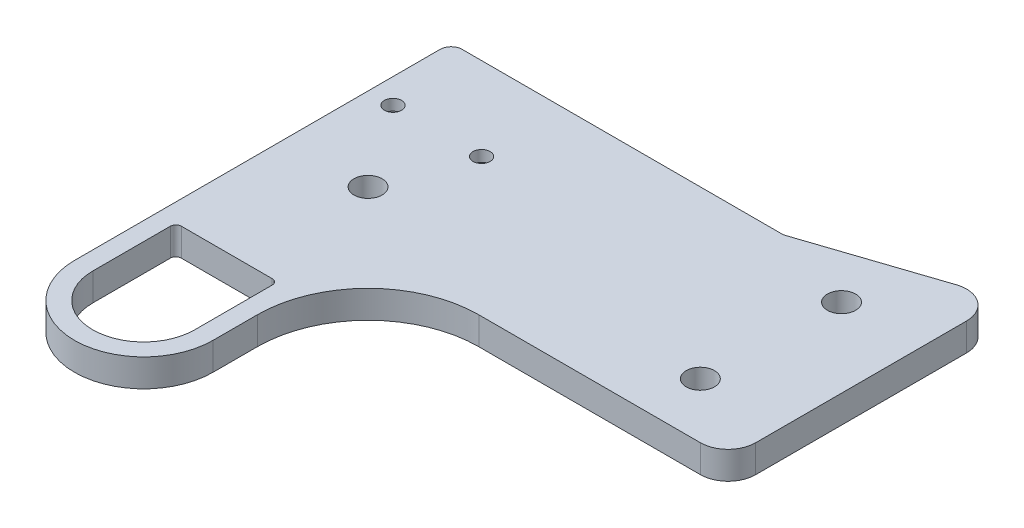
ISO-10303-21;
HEADER;
FILE_DESCRIPTION(('STEP AP214'),'2;1');
FILE_NAME('part.step','',(''),(''),'','','');
FILE_SCHEMA(('AUTOMOTIVE_DESIGN { 1 0 10303 214 1 1 1 1 }'));
ENDSEC;
DATA;
#1=APPLICATION_CONTEXT('core data for automotive mechanical design processes');
#2=APPLICATION_PROTOCOL_DEFINITION('international standard','automotive_design',2000,#1);
#3=PRODUCT_CONTEXT('',#1,'mechanical');
#4=PRODUCT('Part','Part','',(#3));
#5=PRODUCT_RELATED_PRODUCT_CATEGORY('part','',(#4));
#6=PRODUCT_DEFINITION_FORMATION('','',#4);
#7=PRODUCT_DEFINITION_CONTEXT('part definition',#1,'design');
#8=PRODUCT_DEFINITION('design','',#6,#7);
#9=PRODUCT_DEFINITION_SHAPE('','',#8);
#10=(LENGTH_UNIT() NAMED_UNIT(*) SI_UNIT(.MILLI.,.METRE.));
#11=(NAMED_UNIT(*) PLANE_ANGLE_UNIT() SI_UNIT($,.RADIAN.));
#12=(NAMED_UNIT(*) SI_UNIT($,.STERADIAN.) SOLID_ANGLE_UNIT());
#13=UNCERTAINTY_MEASURE_WITH_UNIT(LENGTH_MEASURE(1.E-05),#10,'distance_accuracy_value','');
#14=(GEOMETRIC_REPRESENTATION_CONTEXT(3) GLOBAL_UNCERTAINTY_ASSIGNED_CONTEXT((#13)) GLOBAL_UNIT_ASSIGNED_CONTEXT((#10,
#11,#12)) REPRESENTATION_CONTEXT('',''));
#15=CARTESIAN_POINT('',(0.,0.,0.));
#16=DIRECTION('',(0.,0.,1.));
#17=DIRECTION('',(1.,0.,0.));
#18=AXIS2_PLACEMENT_3D('',#15,#16,#17);
#19=CARTESIAN_POINT('',(4.50000000000001,0.,-4.99999999999998));
#20=DIRECTION('',(0.,1.,0.));
#21=DIRECTION('',(0.,0.,1.));
#22=AXIS2_PLACEMENT_3D('',#19,#20,#21);
#23=CYLINDRICAL_SURFACE('',#22,1.55);
#24=CARTESIAN_POINT('',(4.50000000000001,5.,-4.99999999999998));
#25=DIRECTION('',(0.,1.,0.));
#26=DIRECTION('',(0.,0.,-1.));
#27=AXIS2_PLACEMENT_3D('',#24,#25,#26);
#28=CIRCLE('',#27,1.55);
#29=CARTESIAN_POINT('',(4.50000000000001,5.,-6.54999999999998));
#30=VERTEX_POINT('',#29);
#31=EDGE_CURVE('E388',#30,#30,#28,.T.);
#32=ORIENTED_EDGE('',*,*,#31,.T.);
#33=EDGE_LOOP('',(#32));
#34=FACE_BOUND('',#33,.T.);
#35=CARTESIAN_POINT('',(4.50000000000001,3.,-4.99999999999998));
#36=DIRECTION('',(0.,-1.,0.));
#37=DIRECTION('',(0.,0.,-1.));
#38=AXIS2_PLACEMENT_3D('',#35,#36,#37);
#39=CIRCLE('',#38,1.55);
#40=CARTESIAN_POINT('',(4.50000000000001,3.,-6.54999999999998));
#41=VERTEX_POINT('',#40);
#42=EDGE_CURVE('E42',#41,#41,#39,.F.);
#43=ORIENTED_EDGE('',*,*,#42,.F.);
#44=EDGE_LOOP('',(#43));
#45=FACE_BOUND('',#44,.T.);
#46=ADVANCED_FACE('F38',(#34,#45),#23,.F.);
#47=CARTESIAN_POINT('',(20.5,0.,-4.99999999999998));
#48=DIRECTION('',(0.,1.,0.));
#49=DIRECTION('',(0.,0.,1.));
#50=AXIS2_PLACEMENT_3D('',#47,#48,#49);
#51=CYLINDRICAL_SURFACE('',#50,1.55);
#52=CARTESIAN_POINT('',(20.5,5.,-4.99999999999998));
#53=DIRECTION('',(0.,1.,0.));
#54=DIRECTION('',(0.,0.,1.));
#55=AXIS2_PLACEMENT_3D('',#52,#53,#54);
#56=CIRCLE('',#55,1.55);
#57=CARTESIAN_POINT('',(20.5,5.,-3.44999999999999));
#58=VERTEX_POINT('',#57);
#59=EDGE_CURVE('E406',#58,#58,#56,.T.);
#60=ORIENTED_EDGE('',*,*,#59,.T.);
#61=EDGE_LOOP('',(#60));
#62=FACE_BOUND('',#61,.T.);
#63=CARTESIAN_POINT('',(20.5,3.,-4.99999999999998));
#64=DIRECTION('',(0.,-1.,0.));
#65=DIRECTION('',(0.,0.,-1.));
#66=AXIS2_PLACEMENT_3D('',#63,#64,#65);
#67=CIRCLE('',#66,1.55);
#68=CARTESIAN_POINT('',(20.5,3.,-6.54999999999998));
#69=VERTEX_POINT('',#68);
#70=EDGE_CURVE('E379',#69,#69,#67,.F.);
#71=ORIENTED_EDGE('',*,*,#70,.F.);
#72=EDGE_LOOP('',(#71));
#73=FACE_BOUND('',#72,.T.);
#74=ADVANCED_FACE('F479',(#62,#73),#51,.F.);
#75=CARTESIAN_POINT('',(12.5,5.,48.));
#76=DIRECTION('',(0.,1.,0.));
#77=DIRECTION('',(0.,0.,1.));
#78=AXIS2_PLACEMENT_3D('',#75,#76,#77);
#79=PLANE('',#78);
#80=ORIENTED_EDGE('',*,*,#59,.F.);
#81=EDGE_LOOP('',(#80));
#82=FACE_BOUND('',#81,.T.);
#83=ORIENTED_EDGE('',*,*,#31,.F.);
#84=EDGE_LOOP('',(#83));
#85=FACE_BOUND('',#84,.T.);
#86=CARTESIAN_POINT('',(4.30000000000001,5.,34.));
#87=DIRECTION('',(0.,1.,0.));
#88=DIRECTION('',(0.,0.,-1.));
#89=AXIS2_PLACEMENT_3D('',#86,#87,#88);
#90=CIRCLE('',#89,1.);
#91=CARTESIAN_POINT('',(4.30000000000001,5.,33.));
#92=VERTEX_POINT('',#91);
#93=CARTESIAN_POINT('',(3.30000000000001,5.,34.));
#94=VERTEX_POINT('',#93);
#95=EDGE_CURVE('E172',#92,#94,#90,.T.);
#96=ORIENTED_EDGE('',*,*,#95,.F.);
#97=DIRECTION('',(-1.,0.,0.));
#98=VECTOR('',#97,1.);
#99=CARTESIAN_POINT('',(4.30000000000001,5.,33.));
#100=LINE('',#99,#98);
#101=CARTESIAN_POINT('',(20.7,5.,33.));
#102=VERTEX_POINT('',#101);
#103=EDGE_CURVE('E194',#102,#92,#100,.T.);
#104=ORIENTED_EDGE('',*,*,#103,.F.);
#105=CARTESIAN_POINT('',(20.7,5.,34.));
#106=DIRECTION('',(0.,1.,0.));
#107=DIRECTION('',(0.,0.,-1.));
#108=AXIS2_PLACEMENT_3D('',#105,#106,#107);
#109=CIRCLE('',#108,1.);
#110=CARTESIAN_POINT('',(21.7,5.,34.));
#111=VERTEX_POINT('',#110);
#112=EDGE_CURVE('E198',#111,#102,#109,.T.);
#113=ORIENTED_EDGE('',*,*,#112,.F.);
#114=DIRECTION('',(0.,0.,-1.));
#115=VECTOR('',#114,1.);
#116=CARTESIAN_POINT('',(21.7,5.,34.));
#117=LINE('',#116,#115);
#118=CARTESIAN_POINT('',(21.7,5.,48.));
#119=VERTEX_POINT('',#118);
#120=EDGE_CURVE('E224',#119,#111,#117,.T.);
#121=ORIENTED_EDGE('',*,*,#120,.F.);
#122=CARTESIAN_POINT('',(12.5,5.,48.));
#123=DIRECTION('',(0.,1.,0.));
#124=DIRECTION('',(0.,0.,1.));
#125=AXIS2_PLACEMENT_3D('',#122,#123,#124);
#126=CIRCLE('',#125,9.2);
#127=CARTESIAN_POINT('',(3.30000000000001,5.,48.));
#128=VERTEX_POINT('',#127);
#129=EDGE_CURVE('E220',#128,#119,#126,.T.);
#130=ORIENTED_EDGE('',*,*,#129,.F.);
#131=DIRECTION('',(0.,0.,1.));
#132=VECTOR('',#131,1.);
#133=CARTESIAN_POINT('',(3.30000000000001,5.,48.));
#134=LINE('',#133,#132);
#135=EDGE_CURVE('E217',#94,#128,#134,.T.);
#136=ORIENTED_EDGE('',*,*,#135,.F.);
#137=EDGE_LOOP('',(#96,#104,#113,#121,#130,#136));
#138=FACE_BOUND('',#137,.T.);
#139=CARTESIAN_POINT('',(15.,5.,10.));
#140=DIRECTION('',(0.,1.,0.));
#141=DIRECTION('',(0.,0.,1.));
#142=AXIS2_PLACEMENT_3D('',#139,#140,#141);
#143=CIRCLE('',#142,2.55);
#144=CARTESIAN_POINT('',(15.,5.,12.55));
#145=VERTEX_POINT('',#144);
#146=EDGE_CURVE('E246',#145,#145,#143,.T.);
#147=ORIENTED_EDGE('',*,*,#146,.F.);
#148=EDGE_LOOP('',(#147));
#149=FACE_BOUND('',#148,.T.);
#150=CARTESIAN_POINT('',(75.7697505292423,5.,-14.7156579758528));
#151=DIRECTION('',(0.,1.,0.));
#152=DIRECTION('',(0.,0.,1.));
#153=AXIS2_PLACEMENT_3D('',#150,#151,#152);
#154=CIRCLE('',#153,2.54999999999999);
#155=CARTESIAN_POINT('',(75.7697505292423,5.,-12.1656579758528));
#156=VERTEX_POINT('',#155);
#157=EDGE_CURVE('E262',#156,#156,#154,.T.);
#158=ORIENTED_EDGE('',*,*,#157,.F.);
#159=EDGE_LOOP('',(#158));
#160=FACE_BOUND('',#159,.T.);
#161=DIRECTION('',(-1.,0.,0.));
#162=VECTOR('',#161,1.);
#163=CARTESIAN_POINT('',(0.,5.,-20.));
#164=LINE('',#163,#162);
#165=CARTESIAN_POINT('',(59.6754446796633,5.,-20.));
#166=VERTEX_POINT('',#165);
#167=CARTESIAN_POINT('',(2.,5.,-20.));
#168=VERTEX_POINT('',#167);
#169=EDGE_CURVE('E410',#166,#168,#164,.T.);
#170=ORIENTED_EDGE('',*,*,#169,.T.);
#171=CARTESIAN_POINT('',(2.,5.,-18.));
#172=DIRECTION('',(0.,1.,0.));
#173=DIRECTION('',(0.,0.,1.));
#174=AXIS2_PLACEMENT_3D('',#171,#172,#173);
#175=CIRCLE('',#174,2.);
#176=CARTESIAN_POINT('',(0.,5.,-18.));
#177=VERTEX_POINT('',#176);
#178=EDGE_CURVE('E64',#168,#177,#175,.T.);
#179=ORIENTED_EDGE('',*,*,#178,.T.);
#180=DIRECTION('',(0.,0.,1.));
#181=VECTOR('',#180,1.);
#182=CARTESIAN_POINT('',(0.,5.,0.));
#183=LINE('',#182,#181);
#184=CARTESIAN_POINT('',(0.,5.,48.));
#185=VERTEX_POINT('',#184);
#186=EDGE_CURVE('E274',#177,#185,#183,.T.);
#187=ORIENTED_EDGE('',*,*,#186,.T.);
#188=CARTESIAN_POINT('',(12.5,5.,48.));
#189=DIRECTION('',(0.,1.,0.));
#190=DIRECTION('',(0.,0.,1.));
#191=AXIS2_PLACEMENT_3D('',#188,#189,#190);
#192=CIRCLE('',#191,12.5);
#193=CARTESIAN_POINT('',(25.,5.,48.));
#194=VERTEX_POINT('',#193);
#195=EDGE_CURVE('E278',#185,#194,#192,.T.);
#196=ORIENTED_EDGE('',*,*,#195,.T.);
#197=DIRECTION('',(0.,0.,-1.));
#198=VECTOR('',#197,1.);
#199=CARTESIAN_POINT('',(25.,5.,48.));
#200=LINE('',#199,#198);
#201=CARTESIAN_POINT('',(25.,5.,40.));
#202=VERTEX_POINT('',#201);
#203=EDGE_CURVE('E281',#194,#202,#200,.T.);
#204=ORIENTED_EDGE('',*,*,#203,.T.);
#205=CARTESIAN_POINT('',(45.,5.,40.));
#206=DIRECTION('',(0.,1.,0.));
#207=DIRECTION('',(0.,0.,1.));
#208=AXIS2_PLACEMENT_3D('',#205,#206,#207);
#209=CIRCLE('',#208,20.);
#210=CARTESIAN_POINT('',(45.,5.,20.));
#211=VERTEX_POINT('',#210);
#212=EDGE_CURVE('E331',#202,#211,#209,.F.);
#213=ORIENTED_EDGE('',*,*,#212,.T.);
#214=DIRECTION('',(1.,0.,0.));
#215=VECTOR('',#214,1.);
#216=CARTESIAN_POINT('',(90.,5.,20.));
#217=LINE('',#216,#215);
#218=CARTESIAN_POINT('',(85.,5.,20.));
#219=VERTEX_POINT('',#218);
#220=EDGE_CURVE('E285',#211,#219,#217,.T.);
#221=ORIENTED_EDGE('',*,*,#220,.T.);
#222=CARTESIAN_POINT('',(85.,5.,15.));
#223=DIRECTION('',(0.,1.,0.));
#224=DIRECTION('',(0.,0.,1.));
#225=AXIS2_PLACEMENT_3D('',#222,#223,#224);
#226=CIRCLE('',#225,5.);
#227=CARTESIAN_POINT('',(90.,5.,15.));
#228=VERTEX_POINT('',#227);
#229=EDGE_CURVE('E353',#219,#228,#226,.T.);
#230=ORIENTED_EDGE('',*,*,#229,.T.);
#231=DIRECTION('',(0.,0.,-1.));
#232=VECTOR('',#231,1.);
#233=CARTESIAN_POINT('',(90.,5.,-30.));
#234=LINE('',#233,#232);
#235=CARTESIAN_POINT('',(90.,5.,-23.062870566386));
#236=VERTEX_POINT('',#235);
#237=EDGE_CURVE('E289',#228,#236,#234,.T.);
#238=ORIENTED_EDGE('',*,*,#237,.T.);
#239=CARTESIAN_POINT('',(85.,5.,-23.062870566386));
#240=DIRECTION('',(0.,1.,0.));
#241=DIRECTION('',(0.,0.,1.));
#242=AXIS2_PLACEMENT_3D('',#239,#240,#241);
#243=CIRCLE('',#242,5.);
#244=CARTESIAN_POINT('',(83.4188611699158,5.,-27.8062870566386));
#245=VERTEX_POINT('',#244);
#246=EDGE_CURVE('E350',#236,#245,#243,.T.);
#247=ORIENTED_EDGE('',*,*,#246,.T.);
#248=DIRECTION('',(-0.948683298050514,0.,0.316227766016838));
#249=VECTOR('',#248,1.);
#250=CARTESIAN_POINT('',(0.,5.,0.));
#251=LINE('',#250,#249);
#252=CARTESIAN_POINT('',(60.3079002116969,5.,-20.102633403899));
#253=VERTEX_POINT('',#252);
#254=EDGE_CURVE('E270',#245,#253,#251,.T.);
#255=ORIENTED_EDGE('',*,*,#254,.T.);
#256=CARTESIAN_POINT('',(59.6754446796633,5.,-22.));
#257=DIRECTION('',(0.,1.,0.));
#258=DIRECTION('',(0.,0.,1.));
#259=AXIS2_PLACEMENT_3D('',#256,#257,#258);
#260=CIRCLE('',#259,2.);
#261=EDGE_CURVE('E48',#253,#166,#260,.F.);
#262=ORIENTED_EDGE('',*,*,#261,.T.);
#263=EDGE_LOOP('',(#170,#179,#187,#196,#204,#213,#221,#230,#238,#247,#255,#262));
#264=FACE_BOUND('',#263,.T.);
#265=CARTESIAN_POINT('',(75.,5.,10.));
#266=DIRECTION('',(0.,1.,0.));
#267=DIRECTION('',(0.,0.,1.));
#268=AXIS2_PLACEMENT_3D('',#265,#266,#267);
#269=CIRCLE('',#268,2.54999999999999);
#270=CARTESIAN_POINT('',(75.,5.,12.55));
#271=VERTEX_POINT('',#270);
#272=EDGE_CURVE('E254',#271,#271,#269,.T.);
#273=ORIENTED_EDGE('',*,*,#272,.F.);
#274=EDGE_LOOP('',(#273));
#275=FACE_BOUND('',#274,.T.);
#276=ADVANCED_FACE('F432',(#82,#85,#138,#149,#160,#264,#275),#79,.T.);
#277=CARTESIAN_POINT('',(12.5,0.,48.));
#278=DIRECTION('',(0.,1.,0.));
#279=DIRECTION('',(0.,0.,1.));
#280=AXIS2_PLACEMENT_3D('',#277,#278,#279);
#281=PLANE('',#280);
#282=CARTESIAN_POINT('',(4.50000000000001,0.,-4.99999999999998));
#283=DIRECTION('',(0.,-1.,0.));
#284=DIRECTION('',(0.,0.,-1.));
#285=AXIS2_PLACEMENT_3D('',#282,#283,#284);
#286=CIRCLE('',#285,3.);
#287=CARTESIAN_POINT('',(4.50000000000001,0.,-7.99999999999998));
#288=VERTEX_POINT('',#287);
#289=EDGE_CURVE('E390',#288,#288,#286,.T.);
#290=ORIENTED_EDGE('',*,*,#289,.F.);
#291=EDGE_LOOP('',(#290));
#292=FACE_BOUND('',#291,.T.);
#293=CARTESIAN_POINT('',(20.5,0.,-4.99999999999998));
#294=DIRECTION('',(0.,-1.,0.));
#295=DIRECTION('',(0.,0.,-1.));
#296=AXIS2_PLACEMENT_3D('',#293,#294,#295);
#297=CIRCLE('',#296,3.);
#298=CARTESIAN_POINT('',(20.5,0.,-7.99999999999998));
#299=VERTEX_POINT('',#298);
#300=EDGE_CURVE('E402',#299,#299,#297,.T.);
#301=ORIENTED_EDGE('',*,*,#300,.F.);
#302=EDGE_LOOP('',(#301));
#303=FACE_BOUND('',#302,.T.);
#304=DIRECTION('',(-1.,0.,0.));
#305=VECTOR('',#304,1.);
#306=CARTESIAN_POINT('',(4.30000000000001,0.,33.));
#307=LINE('',#306,#305);
#308=CARTESIAN_POINT('',(20.7,0.,33.));
#309=VERTEX_POINT('',#308);
#310=CARTESIAN_POINT('',(4.30000000000001,0.,33.));
#311=VERTEX_POINT('',#310);
#312=EDGE_CURVE('E178',#309,#311,#307,.T.);
#313=ORIENTED_EDGE('',*,*,#312,.T.);
#314=CARTESIAN_POINT('',(4.30000000000001,0.,34.));
#315=DIRECTION('',(0.,1.,0.));
#316=DIRECTION('',(0.,0.,-1.));
#317=AXIS2_PLACEMENT_3D('',#314,#315,#316);
#318=CIRCLE('',#317,1.);
#319=CARTESIAN_POINT('',(3.30000000000001,0.,34.));
#320=VERTEX_POINT('',#319);
#321=EDGE_CURVE('E169',#311,#320,#318,.T.);
#322=ORIENTED_EDGE('',*,*,#321,.T.);
#323=DIRECTION('',(0.,0.,1.));
#324=VECTOR('',#323,1.);
#325=CARTESIAN_POINT('',(3.30000000000001,0.,48.));
#326=LINE('',#325,#324);
#327=CARTESIAN_POINT('',(3.30000000000001,0.,48.));
#328=VERTEX_POINT('',#327);
#329=EDGE_CURVE('E182',#320,#328,#326,.T.);
#330=ORIENTED_EDGE('',*,*,#329,.T.);
#331=CARTESIAN_POINT('',(12.5,0.,48.));
#332=DIRECTION('',(0.,1.,0.));
#333=DIRECTION('',(0.,0.,1.));
#334=AXIS2_PLACEMENT_3D('',#331,#332,#333);
#335=CIRCLE('',#334,9.2);
#336=CARTESIAN_POINT('',(21.7,0.,48.));
#337=VERTEX_POINT('',#336);
#338=EDGE_CURVE('E187',#328,#337,#335,.T.);
#339=ORIENTED_EDGE('',*,*,#338,.T.);
#340=DIRECTION('',(0.,0.,-1.));
#341=VECTOR('',#340,1.);
#342=CARTESIAN_POINT('',(21.7,0.,34.));
#343=LINE('',#342,#341);
#344=CARTESIAN_POINT('',(21.7,0.,34.));
#345=VERTEX_POINT('',#344);
#346=EDGE_CURVE('E206',#337,#345,#343,.T.);
#347=ORIENTED_EDGE('',*,*,#346,.T.);
#348=CARTESIAN_POINT('',(20.7,0.,34.));
#349=DIRECTION('',(0.,1.,0.));
#350=DIRECTION('',(0.,0.,-1.));
#351=AXIS2_PLACEMENT_3D('',#348,#349,#350);
#352=CIRCLE('',#351,1.);
#353=EDGE_CURVE('E210',#345,#309,#352,.T.);
#354=ORIENTED_EDGE('',*,*,#353,.T.);
#355=EDGE_LOOP('',(#313,#322,#330,#339,#347,#354));
#356=FACE_BOUND('',#355,.T.);
#357=DIRECTION('',(0.,0.,1.));
#358=VECTOR('',#357,1.);
#359=CARTESIAN_POINT('',(0.,0.,0.));
#360=LINE('',#359,#358);
#361=CARTESIAN_POINT('',(0.,0.,-18.));
#362=VERTEX_POINT('',#361);
#363=CARTESIAN_POINT('',(0.,0.,48.));
#364=VERTEX_POINT('',#363);
#365=EDGE_CURVE('E297',#362,#364,#360,.T.);
#366=ORIENTED_EDGE('',*,*,#365,.F.);
#367=CARTESIAN_POINT('',(2.,0.,-18.));
#368=DIRECTION('',(0.,1.,0.));
#369=DIRECTION('',(0.,0.,1.));
#370=AXIS2_PLACEMENT_3D('',#367,#368,#369);
#371=CIRCLE('',#370,2.);
#372=CARTESIAN_POINT('',(2.,0.,-20.));
#373=VERTEX_POINT('',#372);
#374=EDGE_CURVE('E375',#362,#373,#371,.F.);
#375=ORIENTED_EDGE('',*,*,#374,.T.);
#376=DIRECTION('',(1.,0.,0.));
#377=VECTOR('',#376,1.);
#378=CARTESIAN_POINT('',(0.,0.,-20.));
#379=LINE('',#378,#377);
#380=CARTESIAN_POINT('',(59.6754446796633,0.,-20.));
#381=VERTEX_POINT('',#380);
#382=EDGE_CURVE('E201',#373,#381,#379,.T.);
#383=ORIENTED_EDGE('',*,*,#382,.T.);
#384=CARTESIAN_POINT('',(59.6754446796633,0.,-22.));
#385=DIRECTION('',(0.,1.,0.));
#386=DIRECTION('',(0.,0.,1.));
#387=AXIS2_PLACEMENT_3D('',#384,#385,#386);
#388=CIRCLE('',#387,2.);
#389=CARTESIAN_POINT('',(60.3079002116969,0.,-20.102633403899));
#390=VERTEX_POINT('',#389);
#391=EDGE_CURVE('E11',#381,#390,#388,.T.);
#392=ORIENTED_EDGE('',*,*,#391,.T.);
#393=DIRECTION('',(-0.948683298050514,0.,0.316227766016838));
#394=VECTOR('',#393,1.);
#395=CARTESIAN_POINT('',(0.,0.,0.));
#396=LINE('',#395,#394);
#397=CARTESIAN_POINT('',(83.4188611699158,0.,-27.8062870566386));
#398=VERTEX_POINT('',#397);
#399=EDGE_CURVE('E266',#398,#390,#396,.T.);
#400=ORIENTED_EDGE('',*,*,#399,.F.);
#401=CARTESIAN_POINT('',(85.,0.,-23.062870566386));
#402=DIRECTION('',(0.,1.,0.));
#403=DIRECTION('',(0.,0.,1.));
#404=AXIS2_PLACEMENT_3D('',#401,#402,#403);
#405=CIRCLE('',#404,5.);
#406=CARTESIAN_POINT('',(90.,0.,-23.062870566386));
#407=VERTEX_POINT('',#406);
#408=EDGE_CURVE('E341',#398,#407,#405,.F.);
#409=ORIENTED_EDGE('',*,*,#408,.T.);
#410=DIRECTION('',(0.,0.,-1.));
#411=VECTOR('',#410,1.);
#412=CARTESIAN_POINT('',(90.,0.,-30.));
#413=LINE('',#412,#411);
#414=CARTESIAN_POINT('',(90.,0.,15.));
#415=VERTEX_POINT('',#414);
#416=EDGE_CURVE('E275',#415,#407,#413,.T.);
#417=ORIENTED_EDGE('',*,*,#416,.F.);
#418=CARTESIAN_POINT('',(85.,0.,15.));
#419=DIRECTION('',(0.,1.,0.));
#420=DIRECTION('',(0.,0.,1.));
#421=AXIS2_PLACEMENT_3D('',#418,#419,#420);
#422=CIRCLE('',#421,5.);
#423=CARTESIAN_POINT('',(85.,0.,20.));
#424=VERTEX_POINT('',#423);
#425=EDGE_CURVE('E344',#415,#424,#422,.F.);
#426=ORIENTED_EDGE('',*,*,#425,.T.);
#427=DIRECTION('',(1.,0.,0.));
#428=VECTOR('',#427,1.);
#429=CARTESIAN_POINT('',(90.,0.,20.));
#430=LINE('',#429,#428);
#431=CARTESIAN_POINT('',(45.,0.,20.));
#432=VERTEX_POINT('',#431);
#433=EDGE_CURVE('E307',#432,#424,#430,.T.);
#434=ORIENTED_EDGE('',*,*,#433,.F.);
#435=CARTESIAN_POINT('',(45.,0.,40.));
#436=DIRECTION('',(0.,1.,0.));
#437=DIRECTION('',(0.,0.,1.));
#438=AXIS2_PLACEMENT_3D('',#435,#436,#437);
#439=CIRCLE('',#438,20.);
#440=CARTESIAN_POINT('',(25.,0.,40.));
#441=VERTEX_POINT('',#440);
#442=EDGE_CURVE('E328',#432,#441,#439,.T.);
#443=ORIENTED_EDGE('',*,*,#442,.T.);
#444=DIRECTION('',(0.,0.,-1.));
#445=VECTOR('',#444,1.);
#446=CARTESIAN_POINT('',(25.,0.,48.));
#447=LINE('',#446,#445);
#448=CARTESIAN_POINT('',(25.,0.,48.));
#449=VERTEX_POINT('',#448);
#450=EDGE_CURVE('E303',#449,#441,#447,.T.);
#451=ORIENTED_EDGE('',*,*,#450,.F.);
#452=CARTESIAN_POINT('',(12.5,0.,48.));
#453=DIRECTION('',(0.,1.,0.));
#454=DIRECTION('',(0.,0.,1.));
#455=AXIS2_PLACEMENT_3D('',#452,#453,#454);
#456=CIRCLE('',#455,12.5);
#457=EDGE_CURVE('E300',#364,#449,#456,.T.);
#458=ORIENTED_EDGE('',*,*,#457,.F.);
#459=EDGE_LOOP('',(#366,#375,#383,#392,#400,#409,#417,#426,#434,#443,#451,#458));
#460=FACE_BOUND('',#459,.T.);
#461=CARTESIAN_POINT('',(75.7697505292423,0.,-14.7156579758528));
#462=DIRECTION('',(0.,1.,0.));
#463=DIRECTION('',(0.,0.,1.));
#464=AXIS2_PLACEMENT_3D('',#461,#462,#463);
#465=CIRCLE('',#464,2.54999999999999);
#466=CARTESIAN_POINT('',(75.7697505292423,0.,-12.1656579758528));
#467=VERTEX_POINT('',#466);
#468=EDGE_CURVE('E258',#467,#467,#465,.T.);
#469=ORIENTED_EDGE('',*,*,#468,.T.);
#470=EDGE_LOOP('',(#469));
#471=FACE_BOUND('',#470,.T.);
#472=CARTESIAN_POINT('',(75.,0.,10.));
#473=DIRECTION('',(0.,1.,0.));
#474=DIRECTION('',(0.,0.,1.));
#475=AXIS2_PLACEMENT_3D('',#472,#473,#474);
#476=CIRCLE('',#475,2.54999999999999);
#477=CARTESIAN_POINT('',(75.,0.,12.55));
#478=VERTEX_POINT('',#477);
#479=EDGE_CURVE('E250',#478,#478,#476,.T.);
#480=ORIENTED_EDGE('',*,*,#479,.T.);
#481=EDGE_LOOP('',(#480));
#482=FACE_BOUND('',#481,.T.);
#483=CARTESIAN_POINT('',(15.,0.,10.));
#484=DIRECTION('',(0.,1.,0.));
#485=DIRECTION('',(0.,0.,1.));
#486=AXIS2_PLACEMENT_3D('',#483,#484,#485);
#487=CIRCLE('',#486,2.55);
#488=CARTESIAN_POINT('',(15.,0.,12.55));
#489=VERTEX_POINT('',#488);
#490=EDGE_CURVE('E234',#489,#489,#487,.T.);
#491=ORIENTED_EDGE('',*,*,#490,.T.);
#492=EDGE_LOOP('',(#491));
#493=FACE_BOUND('',#492,.T.);
#494=ADVANCED_FACE('F189',(#292,#303,#356,#460,#471,#482,#493),#281,.F.);
#495=CARTESIAN_POINT('',(0.,5.,0.));
#496=DIRECTION('',(0.316227766016838,0.,0.948683298050514));
#497=DIRECTION('',(0.948683298050514,0.,-0.316227766016838));
#498=AXIS2_PLACEMENT_3D('',#495,#496,#497);
#499=PLANE('',#498);
#500=ORIENTED_EDGE('',*,*,#399,.T.);
#501=DIRECTION('',(0.,1.,0.));
#502=VECTOR('',#501,1.);
#503=CARTESIAN_POINT('',(60.3079002116969,5.,-20.102633403899));
#504=LINE('',#503,#502);
#505=EDGE_CURVE('E360',#390,#253,#504,.T.);
#506=ORIENTED_EDGE('',*,*,#505,.T.);
#507=ORIENTED_EDGE('',*,*,#254,.F.);
#508=DIRECTION('',(0.,-1.,0.));
#509=VECTOR('',#508,1.);
#510=CARTESIAN_POINT('',(83.4188611699158,5.,-27.8062870566386));
#511=LINE('',#510,#509);
#512=EDGE_CURVE('E356',#245,#398,#511,.T.);
#513=ORIENTED_EDGE('',*,*,#512,.T.);
#514=EDGE_LOOP('',(#500,#506,#507,#513));
#515=FACE_BOUND('',#514,.T.);
#516=ADVANCED_FACE('F430',(#515),#499,.F.);
#517=CARTESIAN_POINT('',(0.,5.,0.));
#518=DIRECTION('',(1.,0.,0.));
#519=DIRECTION('',(0.,0.,-1.));
#520=AXIS2_PLACEMENT_3D('',#517,#518,#519);
#521=PLANE('',#520);
#522=ORIENTED_EDGE('',*,*,#186,.F.);
#523=DIRECTION('',(0.,1.,0.));
#524=VECTOR('',#523,1.);
#525=CARTESIAN_POINT('',(0.,0.,-18.));
#526=LINE('',#525,#524);
#527=EDGE_CURVE('E56',#177,#362,#526,.F.);
#528=ORIENTED_EDGE('',*,*,#527,.T.);
#529=ORIENTED_EDGE('',*,*,#365,.T.);
#530=DIRECTION('',(0.,-1.,0.));
#531=VECTOR('',#530,1.);
#532=CARTESIAN_POINT('',(0.,5.,48.));
#533=LINE('',#532,#531);
#534=EDGE_CURVE('E317',#185,#364,#533,.T.);
#535=ORIENTED_EDGE('',*,*,#534,.F.);
#536=EDGE_LOOP('',(#522,#528,#529,#535));
#537=FACE_BOUND('',#536,.T.);
#538=ADVANCED_FACE('F555',(#537),#521,.F.);
#539=CARTESIAN_POINT('',(12.5,5.,48.));
#540=DIRECTION('',(0.,-1.,0.));
#541=DIRECTION('',(0.,0.,-1.));
#542=AXIS2_PLACEMENT_3D('',#539,#540,#541);
#543=CYLINDRICAL_SURFACE('',#542,12.5);
#544=ORIENTED_EDGE('',*,*,#457,.T.);
#545=DIRECTION('',(0.,-1.,0.));
#546=VECTOR('',#545,1.);
#547=CARTESIAN_POINT('',(25.,5.,48.));
#548=LINE('',#547,#546);
#549=EDGE_CURVE('E293',#194,#449,#548,.T.);
#550=ORIENTED_EDGE('',*,*,#549,.F.);
#551=ORIENTED_EDGE('',*,*,#195,.F.);
#552=ORIENTED_EDGE('',*,*,#534,.T.);
#553=EDGE_LOOP('',(#544,#550,#551,#552));
#554=FACE_BOUND('',#553,.T.);
#555=ADVANCED_FACE('F464',(#554),#543,.T.);
#556=CARTESIAN_POINT('',(25.,5.,48.));
#557=DIRECTION('',(-1.,0.,0.));
#558=DIRECTION('',(0.,0.,1.));
#559=AXIS2_PLACEMENT_3D('',#556,#557,#558);
#560=PLANE('',#559);
#561=ORIENTED_EDGE('',*,*,#450,.T.);
#562=DIRECTION('',(0.,-1.,0.));
#563=VECTOR('',#562,1.);
#564=CARTESIAN_POINT('',(25.,5.,40.));
#565=LINE('',#564,#563);
#566=EDGE_CURVE('E325',#441,#202,#565,.F.);
#567=ORIENTED_EDGE('',*,*,#566,.T.);
#568=ORIENTED_EDGE('',*,*,#203,.F.);
#569=ORIENTED_EDGE('',*,*,#549,.T.);
#570=EDGE_LOOP('',(#561,#567,#568,#569));
#571=FACE_BOUND('',#570,.T.);
#572=ADVANCED_FACE('F459',(#571),#560,.F.);
#573=CARTESIAN_POINT('',(90.,5.,20.));
#574=DIRECTION('',(0.,0.,-1.));
#575=DIRECTION('',(-1.,0.,0.));
#576=AXIS2_PLACEMENT_3D('',#573,#574,#575);
#577=PLANE('',#576);
#578=ORIENTED_EDGE('',*,*,#433,.T.);
#579=DIRECTION('',(0.,-1.,0.));
#580=VECTOR('',#579,1.);
#581=CARTESIAN_POINT('',(85.,5.,20.));
#582=LINE('',#581,#580);
#583=EDGE_CURVE('E347',#424,#219,#582,.F.);
#584=ORIENTED_EDGE('',*,*,#583,.T.);
#585=ORIENTED_EDGE('',*,*,#220,.F.);
#586=DIRECTION('',(0.,-1.,0.));
#587=VECTOR('',#586,1.);
#588=CARTESIAN_POINT('',(45.,0.,20.));
#589=LINE('',#588,#587);
#590=EDGE_CURVE('E321',#211,#432,#589,.T.);
#591=ORIENTED_EDGE('',*,*,#590,.T.);
#592=EDGE_LOOP('',(#578,#584,#585,#591));
#593=FACE_BOUND('',#592,.T.);
#594=ADVANCED_FACE('F449',(#593),#577,.F.);
#595=CARTESIAN_POINT('',(90.,5.,-30.));
#596=DIRECTION('',(-1.,0.,0.));
#597=DIRECTION('',(0.,0.,1.));
#598=AXIS2_PLACEMENT_3D('',#595,#596,#597);
#599=PLANE('',#598);
#600=ORIENTED_EDGE('',*,*,#237,.F.);
#601=DIRECTION('',(0.,-1.,0.));
#602=VECTOR('',#601,1.);
#603=CARTESIAN_POINT('',(90.,5.,15.));
#604=LINE('',#603,#602);
#605=EDGE_CURVE('E337',#228,#415,#604,.T.);
#606=ORIENTED_EDGE('',*,*,#605,.T.);
#607=ORIENTED_EDGE('',*,*,#416,.T.);
#608=DIRECTION('',(0.,-1.,0.));
#609=VECTOR('',#608,1.);
#610=CARTESIAN_POINT('',(90.,5.,-23.062870566386));
#611=LINE('',#610,#609);
#612=EDGE_CURVE('E334',#407,#236,#611,.F.);
#613=ORIENTED_EDGE('',*,*,#612,.T.);
#614=EDGE_LOOP('',(#600,#606,#607,#613));
#615=FACE_BOUND('',#614,.T.);
#616=ADVANCED_FACE('F441',(#615),#599,.F.);
#617=CARTESIAN_POINT('',(75.7697505292423,5.,-14.7156579758528));
#618=DIRECTION('',(0.,-1.,0.));
#619=DIRECTION('',(0.,0.,-1.));
#620=AXIS2_PLACEMENT_3D('',#617,#618,#619);
#621=CYLINDRICAL_SURFACE('',#620,2.54999999999999);
#622=ORIENTED_EDGE('',*,*,#157,.T.);
#623=EDGE_LOOP('',(#622));
#624=FACE_BOUND('',#623,.T.);
#625=ORIENTED_EDGE('',*,*,#468,.F.);
#626=EDGE_LOOP('',(#625));
#627=FACE_BOUND('',#626,.T.);
#628=ADVANCED_FACE('F675',(#624,#627),#621,.F.);
#629=CARTESIAN_POINT('',(75.,5.,10.));
#630=DIRECTION('',(0.,-1.,0.));
#631=DIRECTION('',(0.,0.,-1.));
#632=AXIS2_PLACEMENT_3D('',#629,#630,#631);
#633=CYLINDRICAL_SURFACE('',#632,2.54999999999999);
#634=ORIENTED_EDGE('',*,*,#272,.T.);
#635=EDGE_LOOP('',(#634));
#636=FACE_BOUND('',#635,.T.);
#637=ORIENTED_EDGE('',*,*,#479,.F.);
#638=EDGE_LOOP('',(#637));
#639=FACE_BOUND('',#638,.T.);
#640=ADVANCED_FACE('F666',(#636,#639),#633,.F.);
#641=CARTESIAN_POINT('',(15.,5.,10.));
#642=DIRECTION('',(0.,-1.,0.));
#643=DIRECTION('',(0.,0.,-1.));
#644=AXIS2_PLACEMENT_3D('',#641,#642,#643);
#645=CYLINDRICAL_SURFACE('',#644,2.55);
#646=ORIENTED_EDGE('',*,*,#146,.T.);
#647=EDGE_LOOP('',(#646));
#648=FACE_BOUND('',#647,.T.);
#649=ORIENTED_EDGE('',*,*,#490,.F.);
#650=EDGE_LOOP('',(#649));
#651=FACE_BOUND('',#650,.T.);
#652=ADVANCED_FACE('F656',(#648,#651),#645,.F.);
#653=CARTESIAN_POINT('',(45.,5.,40.));
#654=DIRECTION('',(0.,1.,0.));
#655=DIRECTION('',(0.,0.,1.));
#656=AXIS2_PLACEMENT_3D('',#653,#654,#655);
#657=CYLINDRICAL_SURFACE('',#656,20.);
#658=ORIENTED_EDGE('',*,*,#212,.F.);
#659=ORIENTED_EDGE('',*,*,#566,.F.);
#660=ORIENTED_EDGE('',*,*,#442,.F.);
#661=ORIENTED_EDGE('',*,*,#590,.F.);
#662=EDGE_LOOP('',(#658,#659,#660,#661));
#663=FACE_BOUND('',#662,.T.);
#664=ADVANCED_FACE('F454',(#663),#657,.F.);
#665=CARTESIAN_POINT('',(85.,5.,15.));
#666=DIRECTION('',(0.,-1.,0.));
#667=DIRECTION('',(0.,0.,-1.));
#668=AXIS2_PLACEMENT_3D('',#665,#666,#667);
#669=CYLINDRICAL_SURFACE('',#668,5.);
#670=ORIENTED_EDGE('',*,*,#229,.F.);
#671=ORIENTED_EDGE('',*,*,#583,.F.);
#672=ORIENTED_EDGE('',*,*,#425,.F.);
#673=ORIENTED_EDGE('',*,*,#605,.F.);
#674=EDGE_LOOP('',(#670,#671,#672,#673));
#675=FACE_BOUND('',#674,.T.);
#676=ADVANCED_FACE('F445',(#675),#669,.T.);
#677=CARTESIAN_POINT('',(85.,5.,-23.062870566386));
#678=DIRECTION('',(0.,-1.,0.));
#679=DIRECTION('',(0.,0.,-1.));
#680=AXIS2_PLACEMENT_3D('',#677,#678,#679);
#681=CYLINDRICAL_SURFACE('',#680,5.);
#682=ORIENTED_EDGE('',*,*,#246,.F.);
#683=ORIENTED_EDGE('',*,*,#612,.F.);
#684=ORIENTED_EDGE('',*,*,#408,.F.);
#685=ORIENTED_EDGE('',*,*,#512,.F.);
#686=EDGE_LOOP('',(#682,#683,#684,#685));
#687=FACE_BOUND('',#686,.T.);
#688=ADVANCED_FACE('F438',(#687),#681,.T.);
#689=CARTESIAN_POINT('',(4.30000000000001,0.,34.));
#690=DIRECTION('',(0.,1.,0.));
#691=DIRECTION('',(0.,0.,1.));
#692=AXIS2_PLACEMENT_3D('',#689,#690,#691);
#693=CYLINDRICAL_SURFACE('',#692,1.);
#694=ORIENTED_EDGE('',*,*,#95,.T.);
#695=DIRECTION('',(0.,1.,0.));
#696=VECTOR('',#695,1.);
#697=CARTESIAN_POINT('',(3.30000000000001,0.,34.));
#698=LINE('',#697,#696);
#699=EDGE_CURVE('E165',#320,#94,#698,.T.);
#700=ORIENTED_EDGE('',*,*,#699,.F.);
#701=ORIENTED_EDGE('',*,*,#321,.F.);
#702=DIRECTION('',(0.,1.,0.));
#703=VECTOR('',#702,1.);
#704=CARTESIAN_POINT('',(4.30000000000001,0.,33.));
#705=LINE('',#704,#703);
#706=EDGE_CURVE('E231',#311,#92,#705,.T.);
#707=ORIENTED_EDGE('',*,*,#706,.T.);
#708=EDGE_LOOP('',(#694,#700,#701,#707));
#709=FACE_BOUND('',#708,.T.);
#710=ADVANCED_FACE('F167',(#709),#693,.F.);
#711=CARTESIAN_POINT('',(4.30000000000001,0.,33.));
#712=DIRECTION('',(0.,0.,-1.));
#713=DIRECTION('',(-1.,0.,0.));
#714=AXIS2_PLACEMENT_3D('',#711,#712,#713);
#715=PLANE('',#714);
#716=ORIENTED_EDGE('',*,*,#103,.T.);
#717=ORIENTED_EDGE('',*,*,#706,.F.);
#718=ORIENTED_EDGE('',*,*,#312,.F.);
#719=DIRECTION('',(0.,1.,0.));
#720=VECTOR('',#719,1.);
#721=CARTESIAN_POINT('',(20.7,0.,33.));
#722=LINE('',#721,#720);
#723=EDGE_CURVE('E235',#309,#102,#722,.T.);
#724=ORIENTED_EDGE('',*,*,#723,.T.);
#725=EDGE_LOOP('',(#716,#717,#718,#724));
#726=FACE_BOUND('',#725,.T.);
#727=ADVANCED_FACE('F618',(#726),#715,.F.);
#728=CARTESIAN_POINT('',(20.7,0.,34.));
#729=DIRECTION('',(0.,1.,0.));
#730=DIRECTION('',(0.,0.,1.));
#731=AXIS2_PLACEMENT_3D('',#728,#729,#730);
#732=CYLINDRICAL_SURFACE('',#731,1.);
#733=ORIENTED_EDGE('',*,*,#112,.T.);
#734=ORIENTED_EDGE('',*,*,#723,.F.);
#735=ORIENTED_EDGE('',*,*,#353,.F.);
#736=DIRECTION('',(0.,1.,0.));
#737=VECTOR('',#736,1.);
#738=CARTESIAN_POINT('',(21.7,0.,34.));
#739=LINE('',#738,#737);
#740=EDGE_CURVE('E238',#345,#111,#739,.T.);
#741=ORIENTED_EDGE('',*,*,#740,.T.);
#742=EDGE_LOOP('',(#733,#734,#735,#741));
#743=FACE_BOUND('',#742,.T.);
#744=ADVANCED_FACE('F609',(#743),#732,.F.);
#745=CARTESIAN_POINT('',(21.7,0.,34.));
#746=DIRECTION('',(1.,0.,0.));
#747=DIRECTION('',(0.,0.,-1.));
#748=AXIS2_PLACEMENT_3D('',#745,#746,#747);
#749=PLANE('',#748);
#750=ORIENTED_EDGE('',*,*,#120,.T.);
#751=ORIENTED_EDGE('',*,*,#740,.F.);
#752=ORIENTED_EDGE('',*,*,#346,.F.);
#753=DIRECTION('',(0.,1.,0.));
#754=VECTOR('',#753,1.);
#755=CARTESIAN_POINT('',(21.7,0.,48.));
#756=LINE('',#755,#754);
#757=EDGE_CURVE('E241',#337,#119,#756,.T.);
#758=ORIENTED_EDGE('',*,*,#757,.T.);
#759=EDGE_LOOP('',(#750,#751,#752,#758));
#760=FACE_BOUND('',#759,.T.);
#761=ADVANCED_FACE('F600',(#760),#749,.F.);
#762=CARTESIAN_POINT('',(12.5,0.,48.));
#763=DIRECTION('',(0.,1.,0.));
#764=DIRECTION('',(0.,0.,1.));
#765=AXIS2_PLACEMENT_3D('',#762,#763,#764);
#766=CYLINDRICAL_SURFACE('',#765,9.2);
#767=ORIENTED_EDGE('',*,*,#129,.T.);
#768=ORIENTED_EDGE('',*,*,#757,.F.);
#769=ORIENTED_EDGE('',*,*,#338,.F.);
#770=DIRECTION('',(0.,1.,0.));
#771=VECTOR('',#770,1.);
#772=CARTESIAN_POINT('',(3.30000000000001,0.,48.));
#773=LINE('',#772,#771);
#774=EDGE_CURVE('E177',#328,#128,#773,.T.);
#775=ORIENTED_EDGE('',*,*,#774,.T.);
#776=EDGE_LOOP('',(#767,#768,#769,#775));
#777=FACE_BOUND('',#776,.T.);
#778=ADVANCED_FACE('F474',(#777),#766,.F.);
#779=CARTESIAN_POINT('',(3.30000000000001,0.,48.));
#780=DIRECTION('',(-1.,0.,0.));
#781=DIRECTION('',(0.,0.,1.));
#782=AXIS2_PLACEMENT_3D('',#779,#780,#781);
#783=PLANE('',#782);
#784=ORIENTED_EDGE('',*,*,#135,.T.);
#785=ORIENTED_EDGE('',*,*,#774,.F.);
#786=ORIENTED_EDGE('',*,*,#329,.F.);
#787=ORIENTED_EDGE('',*,*,#699,.T.);
#788=EDGE_LOOP('',(#784,#785,#786,#787));
#789=FACE_BOUND('',#788,.T.);
#790=ADVANCED_FACE('F183',(#789),#783,.F.);
#791=CARTESIAN_POINT('',(0.,-63.2455532033676,-20.));
#792=DIRECTION('',(0.,0.,-1.));
#793=DIRECTION('',(-1.,0.,0.));
#794=AXIS2_PLACEMENT_3D('',#791,#792,#793);
#795=PLANE('',#794);
#796=ORIENTED_EDGE('',*,*,#169,.F.);
#797=DIRECTION('',(0.,1.,0.));
#798=VECTOR('',#797,1.);
#799=CARTESIAN_POINT('',(59.6754446796633,-63.2455532033676,-20.));
#800=LINE('',#799,#798);
#801=EDGE_CURVE('E368',#166,#381,#800,.F.);
#802=ORIENTED_EDGE('',*,*,#801,.T.);
#803=ORIENTED_EDGE('',*,*,#382,.F.);
#804=DIRECTION('',(0.,1.,0.));
#805=VECTOR('',#804,1.);
#806=CARTESIAN_POINT('',(2.,5.,-20.));
#807=LINE('',#806,#805);
#808=EDGE_CURVE('E364',#373,#168,#807,.T.);
#809=ORIENTED_EDGE('',*,*,#808,.T.);
#810=EDGE_LOOP('',(#796,#802,#803,#809));
#811=FACE_BOUND('',#810,.T.);
#812=ADVANCED_FACE('F467',(#811),#795,.T.);
#813=CARTESIAN_POINT('',(59.6754446796633,5.,-22.));
#814=DIRECTION('',(0.,1.,0.));
#815=DIRECTION('',(0.,0.,1.));
#816=AXIS2_PLACEMENT_3D('',#813,#814,#815);
#817=CYLINDRICAL_SURFACE('',#816,2.);
#818=ORIENTED_EDGE('',*,*,#391,.F.);
#819=ORIENTED_EDGE('',*,*,#801,.F.);
#820=ORIENTED_EDGE('',*,*,#261,.F.);
#821=ORIENTED_EDGE('',*,*,#505,.F.);
#822=EDGE_LOOP('',(#818,#819,#820,#821));
#823=FACE_BOUND('',#822,.T.);
#824=ADVANCED_FACE('F427',(#823),#817,.F.);
#825=CARTESIAN_POINT('',(2.,-63.2455532033676,-18.));
#826=DIRECTION('',(0.,-1.,0.));
#827=DIRECTION('',(0.,0.,-1.));
#828=AXIS2_PLACEMENT_3D('',#825,#826,#827);
#829=CYLINDRICAL_SURFACE('',#828,2.);
#830=ORIENTED_EDGE('',*,*,#374,.F.);
#831=ORIENTED_EDGE('',*,*,#527,.F.);
#832=ORIENTED_EDGE('',*,*,#178,.F.);
#833=ORIENTED_EDGE('',*,*,#808,.F.);
#834=EDGE_LOOP('',(#830,#831,#832,#833));
#835=FACE_BOUND('',#834,.T.);
#836=ADVANCED_FACE('F40',(#835),#829,.T.);
#837=CARTESIAN_POINT('',(20.5,3.,-4.99999999999998));
#838=DIRECTION('',(0.,-1.,0.));
#839=DIRECTION('',(0.,0.,-1.));
#840=AXIS2_PLACEMENT_3D('',#837,#838,#839);
#841=PLANE('',#840);
#842=CARTESIAN_POINT('',(20.5,3.,-4.99999999999998));
#843=DIRECTION('',(0.,-1.,0.));
#844=DIRECTION('',(0.,0.,-1.));
#845=AXIS2_PLACEMENT_3D('',#842,#843,#844);
#846=CIRCLE('',#845,3.);
#847=CARTESIAN_POINT('',(20.5,3.,-7.99999999999998));
#848=VERTEX_POINT('',#847);
#849=EDGE_CURVE('E396',#848,#848,#846,.T.);
#850=ORIENTED_EDGE('',*,*,#849,.T.);
#851=EDGE_LOOP('',(#850));
#852=FACE_BOUND('',#851,.T.);
#853=ORIENTED_EDGE('',*,*,#70,.T.);
#854=EDGE_LOOP('',(#853));
#855=FACE_BOUND('',#854,.T.);
#856=ADVANCED_FACE('F493',(#852,#855),#841,.T.);
#857=CARTESIAN_POINT('',(20.5,3.,-4.99999999999998));
#858=DIRECTION('',(0.,-1.,0.));
#859=DIRECTION('',(0.,0.,-1.));
#860=AXIS2_PLACEMENT_3D('',#857,#858,#859);
#861=CYLINDRICAL_SURFACE('',#860,3.);
#862=ORIENTED_EDGE('',*,*,#849,.F.);
#863=EDGE_LOOP('',(#862));
#864=FACE_BOUND('',#863,.T.);
#865=ORIENTED_EDGE('',*,*,#300,.T.);
#866=EDGE_LOOP('',(#865));
#867=FACE_BOUND('',#866,.T.);
#868=ADVANCED_FACE('F489',(#864,#867),#861,.F.);
#869=CARTESIAN_POINT('',(4.50000000000001,3.,-4.99999999999998));
#870=DIRECTION('',(0.,-1.,0.));
#871=DIRECTION('',(0.,0.,-1.));
#872=AXIS2_PLACEMENT_3D('',#869,#870,#871);
#873=PLANE('',#872);
#874=CARTESIAN_POINT('',(4.50000000000001,3.,-4.99999999999998));
#875=DIRECTION('',(0.,-1.,0.));
#876=DIRECTION('',(0.,0.,-1.));
#877=AXIS2_PLACEMENT_3D('',#874,#875,#876);
#878=CIRCLE('',#877,3.);
#879=CARTESIAN_POINT('',(4.50000000000001,3.,-7.99999999999998));
#880=VERTEX_POINT('',#879);
#881=EDGE_CURVE('E382',#880,#880,#878,.T.);
#882=ORIENTED_EDGE('',*,*,#881,.T.);
#883=EDGE_LOOP('',(#882));
#884=FACE_BOUND('',#883,.T.);
#885=ORIENTED_EDGE('',*,*,#42,.T.);
#886=EDGE_LOOP('',(#885));
#887=FACE_BOUND('',#886,.T.);
#888=ADVANCED_FACE('F492',(#884,#887),#873,.T.);
#889=CARTESIAN_POINT('',(4.50000000000001,3.,-4.99999999999998));
#890=DIRECTION('',(0.,-1.,0.));
#891=DIRECTION('',(0.,0.,-1.));
#892=AXIS2_PLACEMENT_3D('',#889,#890,#891);
#893=CYLINDRICAL_SURFACE('',#892,3.);
#894=ORIENTED_EDGE('',*,*,#881,.F.);
#895=EDGE_LOOP('',(#894));
#896=FACE_BOUND('',#895,.T.);
#897=ORIENTED_EDGE('',*,*,#289,.T.);
#898=EDGE_LOOP('',(#897));
#899=FACE_BOUND('',#898,.T.);
#900=ADVANCED_FACE('F498',(#896,#899),#893,.F.);
#901=CLOSED_SHELL('',(#46,#74,#276,#494,#516,#538,#555,#572,#594,#616,#628,#640,#652,#664,#676,
#688,#710,#727,#744,#761,#778,#790,#812,#824,#836,#856,#868,#888,#900));
#902=MANIFOLD_SOLID_BREP('B2',#901);
#903=ADVANCED_BREP_SHAPE_REPRESENTATION('',(#18,#902),#14);
#904=SHAPE_DEFINITION_REPRESENTATION(#9,#903);
ENDSEC;
END-ISO-10303-21;
